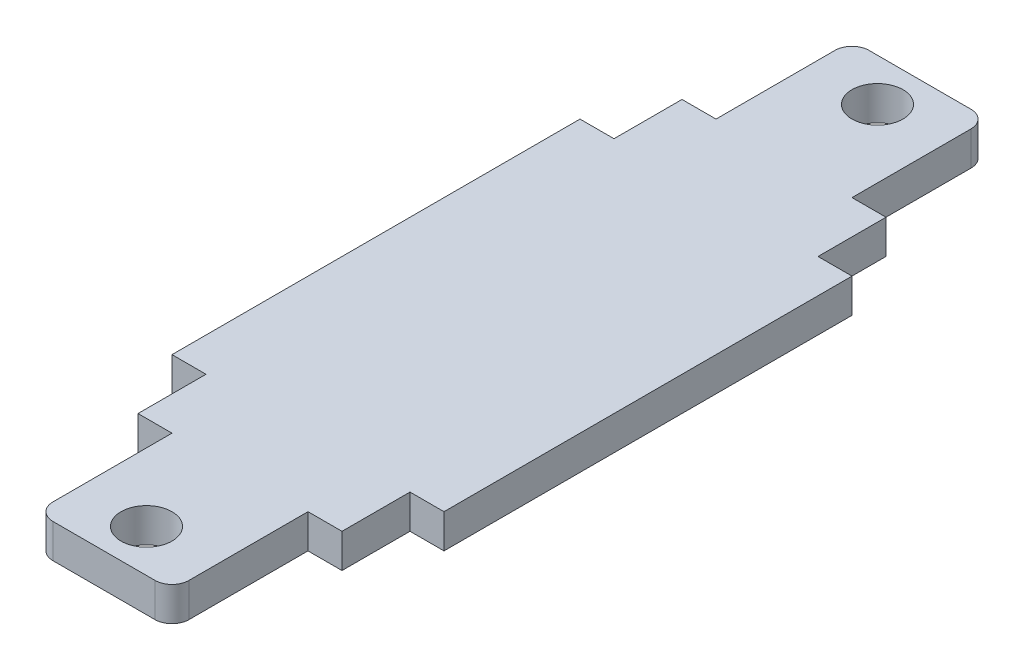
ISO-10303-21;
HEADER;
FILE_DESCRIPTION(('STEP AP214'),'2;1');
FILE_NAME('part.step','',(''),(''),'','','');
FILE_SCHEMA(('AUTOMOTIVE_DESIGN { 1 0 10303 214 1 1 1 1 }'));
ENDSEC;
DATA;
#1=APPLICATION_CONTEXT('core data for automotive mechanical design processes');
#2=APPLICATION_PROTOCOL_DEFINITION('international standard','automotive_design',2000,#1);
#3=PRODUCT_CONTEXT('',#1,'mechanical');
#4=PRODUCT('Part','Part','',(#3));
#5=PRODUCT_RELATED_PRODUCT_CATEGORY('part','',(#4));
#6=PRODUCT_DEFINITION_FORMATION('','',#4);
#7=PRODUCT_DEFINITION_CONTEXT('part definition',#1,'design');
#8=PRODUCT_DEFINITION('design','',#6,#7);
#9=PRODUCT_DEFINITION_SHAPE('','',#8);
#10=(LENGTH_UNIT() NAMED_UNIT(*) SI_UNIT(.MILLI.,.METRE.));
#11=(NAMED_UNIT(*) PLANE_ANGLE_UNIT() SI_UNIT($,.RADIAN.));
#12=(NAMED_UNIT(*) SI_UNIT($,.STERADIAN.) SOLID_ANGLE_UNIT());
#13=UNCERTAINTY_MEASURE_WITH_UNIT(LENGTH_MEASURE(1.E-05),#10,'distance_accuracy_value','');
#14=(GEOMETRIC_REPRESENTATION_CONTEXT(3) GLOBAL_UNCERTAINTY_ASSIGNED_CONTEXT((#13)) GLOBAL_UNIT_ASSIGNED_CONTEXT((#10,
#11,#12)) REPRESENTATION_CONTEXT('',''));
#15=CARTESIAN_POINT('',(0.,0.,0.));
#16=DIRECTION('',(0.,0.,1.));
#17=DIRECTION('',(1.,0.,0.));
#18=AXIS2_PLACEMENT_3D('',#15,#16,#17);
#19=CARTESIAN_POINT('',(191.916318128345,374.20180844309,9.525));
#20=DIRECTION('',(0.,-1.,0.));
#21=DIRECTION('',(0.,0.,-1.));
#22=AXIS2_PLACEMENT_3D('',#19,#20,#21);
#23=PLANE('',#22);
#24=CARTESIAN_POINT('',(179.216318128345,374.20180844309,5.55624999999998));
#25=DIRECTION('',(0.,-1.,0.));
#26=DIRECTION('',(0.,0.,-1.));
#27=AXIS2_PLACEMENT_3D('',#24,#25,#26);
#28=CIRCLE('',#27,2.38125000000001);
#29=CARTESIAN_POINT('',(179.216318128345,374.20180844309,3.17499999999998));
#30=VERTEX_POINT('',#29);
#31=EDGE_CURVE('E302',#30,#30,#28,.T.);
#32=ORIENTED_EDGE('',*,*,#31,.T.);
#33=EDGE_LOOP('',(#32));
#34=FACE_BOUND('',#33,.T.);
#35=CARTESIAN_POINT('',(179.216318128345,374.20180844309,-62.70625));
#36=DIRECTION('',(0.,1.,0.));
#37=DIRECTION('',(0.,0.,1.));
#38=AXIS2_PLACEMENT_3D('',#35,#36,#37);
#39=CIRCLE('',#38,2.38125);
#40=CARTESIAN_POINT('',(179.216318128345,374.20180844309,-60.325));
#41=VERTEX_POINT('',#40);
#42=EDGE_CURVE('E380',#41,#41,#39,.T.);
#43=ORIENTED_EDGE('',*,*,#42,.F.);
#44=EDGE_LOOP('',(#43));
#45=FACE_BOUND('',#44,.T.);
#46=DIRECTION('',(1.,0.,0.));
#47=VECTOR('',#46,1.);
#48=CARTESIAN_POINT('',(0.,374.20180844309,-9.525));
#49=LINE('',#48,#47);
#50=CARTESIAN_POINT('',(166.516318128345,374.20180844309,-9.525));
#51=VERTEX_POINT('',#50);
#52=CARTESIAN_POINT('',(169.691318128345,374.20180844309,-9.525));
#53=VERTEX_POINT('',#52);
#54=EDGE_CURVE('E282',#51,#53,#49,.T.);
#55=ORIENTED_EDGE('',*,*,#54,.T.);
#56=DIRECTION('',(0.,0.,-1.));
#57=VECTOR('',#56,1.);
#58=CARTESIAN_POINT('',(169.691318128345,374.20180844309,0.));
#59=LINE('',#58,#57);
#60=CARTESIAN_POINT('',(169.691318128345,374.20180844309,-3.175));
#61=VERTEX_POINT('',#60);
#62=EDGE_CURVE('E293',#61,#53,#59,.T.);
#63=ORIENTED_EDGE('',*,*,#62,.F.);
#64=DIRECTION('',(1.,0.,0.));
#65=VECTOR('',#64,1.);
#66=CARTESIAN_POINT('',(0.,374.20180844309,-3.17499999999963));
#67=LINE('',#66,#65);
#68=CARTESIAN_POINT('',(172.866318128345,374.20180844309,-3.175));
#69=VERTEX_POINT('',#68);
#70=EDGE_CURVE('E451',#61,#69,#67,.T.);
#71=ORIENTED_EDGE('',*,*,#70,.T.);
#72=DIRECTION('',(0.,0.,-1.));
#73=VECTOR('',#72,1.);
#74=CARTESIAN_POINT('',(172.866318128345,374.20180844309,-4.317664039781E-13));
#75=LINE('',#74,#73);
#76=CARTESIAN_POINT('',(172.866318128345,374.20180844309,7.93749999999999));
#77=VERTEX_POINT('',#76);
#78=EDGE_CURVE('E448',#77,#69,#75,.T.);
#79=ORIENTED_EDGE('',*,*,#78,.F.);
#80=CARTESIAN_POINT('',(174.453818128345,374.20180844309,7.93749999999999));
#81=DIRECTION('',(0.,1.,0.));
#82=DIRECTION('',(0.,0.,1.));
#83=AXIS2_PLACEMENT_3D('',#80,#81,#82);
#84=CIRCLE('',#83,1.58749999999998);
#85=CARTESIAN_POINT('',(174.453818128345,374.20180844309,9.525));
#86=VERTEX_POINT('',#85);
#87=EDGE_CURVE('E445',#86,#77,#84,.F.);
#88=ORIENTED_EDGE('',*,*,#87,.F.);
#89=DIRECTION('',(-1.,0.,0.));
#90=VECTOR('',#89,1.);
#91=CARTESIAN_POINT('',(191.916318128345,374.20180844309,9.525));
#92=LINE('',#91,#90);
#93=CARTESIAN_POINT('',(183.978818128345,374.20180844309,9.525));
#94=VERTEX_POINT('',#93);
#95=EDGE_CURVE('E315',#94,#86,#92,.T.);
#96=ORIENTED_EDGE('',*,*,#95,.F.);
#97=CARTESIAN_POINT('',(183.978818128345,374.20180844309,7.93749999999999));
#98=DIRECTION('',(0.,1.,0.));
#99=DIRECTION('',(0.,0.,1.));
#100=AXIS2_PLACEMENT_3D('',#97,#98,#99);
#101=CIRCLE('',#100,1.58749999999999);
#102=CARTESIAN_POINT('',(185.566318128345,374.20180844309,7.93749999999999));
#103=VERTEX_POINT('',#102);
#104=EDGE_CURVE('E146',#94,#103,#101,.T.);
#105=ORIENTED_EDGE('',*,*,#104,.T.);
#106=DIRECTION('',(0.,0.,-1.));
#107=VECTOR('',#106,1.);
#108=CARTESIAN_POINT('',(185.566318128345,374.20180844309,0.));
#109=LINE('',#108,#107);
#110=CARTESIAN_POINT('',(185.566318128345,374.20180844309,-3.175));
#111=VERTEX_POINT('',#110);
#112=EDGE_CURVE('E441',#103,#111,#109,.T.);
#113=ORIENTED_EDGE('',*,*,#112,.T.);
#114=DIRECTION('',(-1.,0.,0.));
#115=VECTOR('',#114,1.);
#116=CARTESIAN_POINT('',(0.,374.20180844309,-3.175));
#117=LINE('',#116,#115);
#118=CARTESIAN_POINT('',(188.741318128345,374.20180844309,-3.175));
#119=VERTEX_POINT('',#118);
#120=EDGE_CURVE('E438',#119,#111,#117,.T.);
#121=ORIENTED_EDGE('',*,*,#120,.F.);
#122=DIRECTION('',(0.,0.,-1.));
#123=VECTOR('',#122,1.);
#124=CARTESIAN_POINT('',(188.741318128345,374.20180844309,0.));
#125=LINE('',#124,#123);
#126=CARTESIAN_POINT('',(188.741318128345,374.20180844309,-9.525));
#127=VERTEX_POINT('',#126);
#128=EDGE_CURVE('E435',#119,#127,#125,.T.);
#129=ORIENTED_EDGE('',*,*,#128,.T.);
#130=DIRECTION('',(-1.,0.,0.));
#131=VECTOR('',#130,1.);
#132=CARTESIAN_POINT('',(0.,374.20180844309,-9.525));
#133=LINE('',#132,#131);
#134=CARTESIAN_POINT('',(191.916318128345,374.20180844309,-9.525));
#135=VERTEX_POINT('',#134);
#136=EDGE_CURVE('E407',#135,#127,#133,.T.);
#137=ORIENTED_EDGE('',*,*,#136,.F.);
#138=DIRECTION('',(0.,0.,-1.));
#139=VECTOR('',#138,1.);
#140=CARTESIAN_POINT('',(191.916318128345,374.20180844309,9.525));
#141=LINE('',#140,#139);
#142=CARTESIAN_POINT('',(191.916318128345,374.20180844309,-47.625));
#143=VERTEX_POINT('',#142);
#144=EDGE_CURVE('E12',#135,#143,#141,.T.);
#145=ORIENTED_EDGE('',*,*,#144,.T.);
#146=DIRECTION('',(-1.,0.,0.));
#147=VECTOR('',#146,1.);
#148=CARTESIAN_POINT('',(0.,374.20180844309,-47.625));
#149=LINE('',#148,#147);
#150=CARTESIAN_POINT('',(188.741318128345,374.20180844309,-47.625));
#151=VERTEX_POINT('',#150);
#152=EDGE_CURVE('E362',#143,#151,#149,.T.);
#153=ORIENTED_EDGE('',*,*,#152,.T.);
#154=DIRECTION('',(0.,0.,1.));
#155=VECTOR('',#154,1.);
#156=CARTESIAN_POINT('',(188.741318128345,374.20180844309,0.));
#157=LINE('',#156,#155);
#158=CARTESIAN_POINT('',(188.741318128345,374.20180844309,-53.975));
#159=VERTEX_POINT('',#158);
#160=EDGE_CURVE('E365',#159,#151,#157,.T.);
#161=ORIENTED_EDGE('',*,*,#160,.F.);
#162=DIRECTION('',(-1.,0.,0.));
#163=VECTOR('',#162,1.);
#164=CARTESIAN_POINT('',(0.,374.20180844309,-53.975));
#165=LINE('',#164,#163);
#166=CARTESIAN_POINT('',(185.566318128345,374.20180844309,-53.975));
#167=VERTEX_POINT('',#166);
#168=EDGE_CURVE('E368',#159,#167,#165,.T.);
#169=ORIENTED_EDGE('',*,*,#168,.T.);
#170=DIRECTION('',(0.,0.,1.));
#171=VECTOR('',#170,1.);
#172=CARTESIAN_POINT('',(185.566318128345,374.20180844309,0.));
#173=LINE('',#172,#171);
#174=CARTESIAN_POINT('',(185.566318128345,374.20180844309,-65.0875));
#175=VERTEX_POINT('',#174);
#176=EDGE_CURVE('E371',#175,#167,#173,.T.);
#177=ORIENTED_EDGE('',*,*,#176,.F.);
#178=CARTESIAN_POINT('',(183.978818128345,374.20180844309,-65.0875));
#179=DIRECTION('',(0.,1.,0.));
#180=DIRECTION('',(0.,0.,1.));
#181=AXIS2_PLACEMENT_3D('',#178,#179,#180);
#182=CIRCLE('',#181,1.58749999999999);
#183=CARTESIAN_POINT('',(183.978818128345,374.20180844309,-66.675));
#184=VERTEX_POINT('',#183);
#185=EDGE_CURVE('E374',#184,#175,#182,.F.);
#186=ORIENTED_EDGE('',*,*,#185,.F.);
#187=DIRECTION('',(-1.,0.,0.));
#188=VECTOR('',#187,1.);
#189=CARTESIAN_POINT('',(191.916318128345,374.20180844309,-66.675));
#190=LINE('',#189,#188);
#191=CARTESIAN_POINT('',(174.453818128345,374.20180844309,-66.675));
#192=VERTEX_POINT('',#191);
#193=EDGE_CURVE('E321',#184,#192,#190,.T.);
#194=ORIENTED_EDGE('',*,*,#193,.T.);
#195=CARTESIAN_POINT('',(174.453818128345,374.20180844309,-65.0875));
#196=DIRECTION('',(0.,1.,0.));
#197=DIRECTION('',(0.,0.,1.));
#198=AXIS2_PLACEMENT_3D('',#195,#196,#197);
#199=CIRCLE('',#198,1.58749999999998);
#200=CARTESIAN_POINT('',(172.866318128345,374.20180844309,-65.0875));
#201=VERTEX_POINT('',#200);
#202=EDGE_CURVE('E377',#192,#201,#199,.T.);
#203=ORIENTED_EDGE('',*,*,#202,.T.);
#204=DIRECTION('',(0.,0.,1.));
#205=VECTOR('',#204,1.);
#206=CARTESIAN_POINT('',(172.866318128344,374.20180844309,4.31766403978099E-13));
#207=LINE('',#206,#205);
#208=CARTESIAN_POINT('',(172.866318128345,374.20180844309,-53.975));
#209=VERTEX_POINT('',#208);
#210=EDGE_CURVE('E352',#201,#209,#207,.T.);
#211=ORIENTED_EDGE('',*,*,#210,.T.);
#212=DIRECTION('',(1.,0.,0.));
#213=VECTOR('',#212,1.);
#214=CARTESIAN_POINT('',(1.17961196366424E-13,374.20180844309,-53.9750000000004));
#215=LINE('',#214,#213);
#216=CARTESIAN_POINT('',(169.691318128345,374.20180844309,-53.975));
#217=VERTEX_POINT('',#216);
#218=EDGE_CURVE('E356',#217,#209,#215,.T.);
#219=ORIENTED_EDGE('',*,*,#218,.F.);
#220=DIRECTION('',(0.,0.,1.));
#221=VECTOR('',#220,1.);
#222=CARTESIAN_POINT('',(169.691318128345,374.20180844309,0.));
#223=LINE('',#222,#221);
#224=CARTESIAN_POINT('',(169.691318128345,374.20180844309,-47.625));
#225=VERTEX_POINT('',#224);
#226=EDGE_CURVE('E359',#217,#225,#223,.T.);
#227=ORIENTED_EDGE('',*,*,#226,.T.);
#228=DIRECTION('',(1.,0.,0.));
#229=VECTOR('',#228,1.);
#230=CARTESIAN_POINT('',(0.,374.20180844309,-47.625));
#231=LINE('',#230,#229);
#232=CARTESIAN_POINT('',(166.516318128345,374.20180844309,-47.625));
#233=VERTEX_POINT('',#232);
#234=EDGE_CURVE('E307',#233,#225,#231,.T.);
#235=ORIENTED_EDGE('',*,*,#234,.F.);
#236=DIRECTION('',(0.,0.,-1.));
#237=VECTOR('',#236,1.);
#238=CARTESIAN_POINT('',(166.516318128345,374.20180844309,9.525));
#239=LINE('',#238,#237);
#240=EDGE_CURVE('E131',#51,#233,#239,.T.);
#241=ORIENTED_EDGE('',*,*,#240,.F.);
#242=EDGE_LOOP('',(#55,#63,#71,#79,#88,#96,#105,#113,#121,#129,#137,#145,#153,#161,#169,#177,
#186,#194,#203,#211,#219,#227,#235,#241));
#243=FACE_BOUND('',#242,.T.);
#244=ADVANCED_FACE('F123',(#34,#45,#243),#23,.F.);
#245=CARTESIAN_POINT('',(191.916318128345,371.02680844309,9.525));
#246=DIRECTION('',(0.,-1.,0.));
#247=DIRECTION('',(0.,0.,-1.));
#248=AXIS2_PLACEMENT_3D('',#245,#246,#247);
#249=PLANE('',#248);
#250=CARTESIAN_POINT('',(179.216318128345,371.02680844309,5.55624999999998));
#251=DIRECTION('',(0.,-1.,0.));
#252=DIRECTION('',(0.,0.,-1.));
#253=AXIS2_PLACEMENT_3D('',#250,#251,#252);
#254=CIRCLE('',#253,2.38125000000001);
#255=CARTESIAN_POINT('',(179.216318128345,371.02680844309,3.17499999999998));
#256=VERTEX_POINT('',#255);
#257=EDGE_CURVE('E475',#256,#256,#254,.T.);
#258=ORIENTED_EDGE('',*,*,#257,.F.);
#259=EDGE_LOOP('',(#258));
#260=FACE_BOUND('',#259,.T.);
#261=CARTESIAN_POINT('',(179.216318128345,371.02680844309,-62.70625));
#262=DIRECTION('',(0.,1.,0.));
#263=DIRECTION('',(0.,0.,1.));
#264=AXIS2_PLACEMENT_3D('',#261,#262,#263);
#265=CIRCLE('',#264,2.38125);
#266=CARTESIAN_POINT('',(179.216318128345,371.02680844309,-60.325));
#267=VERTEX_POINT('',#266);
#268=EDGE_CURVE('E404',#267,#267,#265,.T.);
#269=ORIENTED_EDGE('',*,*,#268,.T.);
#270=EDGE_LOOP('',(#269));
#271=FACE_BOUND('',#270,.T.);
#272=DIRECTION('',(0.,0.,-1.));
#273=VECTOR('',#272,1.);
#274=CARTESIAN_POINT('',(169.691318128345,371.02680844309,0.));
#275=LINE('',#274,#273);
#276=CARTESIAN_POINT('',(169.691318128345,371.02680844309,-3.175));
#277=VERTEX_POINT('',#276);
#278=CARTESIAN_POINT('',(169.691318128345,371.02680844309,-9.525));
#279=VERTEX_POINT('',#278);
#280=EDGE_CURVE('E427',#277,#279,#275,.T.);
#281=ORIENTED_EDGE('',*,*,#280,.T.);
#282=DIRECTION('',(1.,0.,0.));
#283=VECTOR('',#282,1.);
#284=CARTESIAN_POINT('',(0.,371.02680844309,-9.525));
#285=LINE('',#284,#283);
#286=CARTESIAN_POINT('',(166.516318128345,371.02680844309,-9.525));
#287=VERTEX_POINT('',#286);
#288=EDGE_CURVE('E430',#287,#279,#285,.T.);
#289=ORIENTED_EDGE('',*,*,#288,.F.);
#290=DIRECTION('',(0.,0.,-1.));
#291=VECTOR('',#290,1.);
#292=CARTESIAN_POINT('',(166.516318128345,371.02680844309,9.525));
#293=LINE('',#292,#291);
#294=CARTESIAN_POINT('',(166.516318128345,371.02680844309,-47.625));
#295=VERTEX_POINT('',#294);
#296=EDGE_CURVE('E301',#287,#295,#293,.T.);
#297=ORIENTED_EDGE('',*,*,#296,.T.);
#298=DIRECTION('',(1.,0.,0.));
#299=VECTOR('',#298,1.);
#300=CARTESIAN_POINT('',(0.,371.02680844309,-47.625));
#301=LINE('',#300,#299);
#302=CARTESIAN_POINT('',(169.691318128345,371.02680844309,-47.625));
#303=VERTEX_POINT('',#302);
#304=EDGE_CURVE('E387',#295,#303,#301,.T.);
#305=ORIENTED_EDGE('',*,*,#304,.T.);
#306=DIRECTION('',(0.,0.,1.));
#307=VECTOR('',#306,1.);
#308=CARTESIAN_POINT('',(169.691318128345,371.02680844309,0.));
#309=LINE('',#308,#307);
#310=CARTESIAN_POINT('',(169.691318128345,371.02680844309,-53.975));
#311=VERTEX_POINT('',#310);
#312=EDGE_CURVE('E385',#311,#303,#309,.T.);
#313=ORIENTED_EDGE('',*,*,#312,.F.);
#314=DIRECTION('',(1.,0.,0.));
#315=VECTOR('',#314,1.);
#316=CARTESIAN_POINT('',(1.17961196366424E-13,371.02680844309,-53.9750000000004));
#317=LINE('',#316,#315);
#318=CARTESIAN_POINT('',(172.866318128345,371.02680844309,-53.975));
#319=VERTEX_POINT('',#318);
#320=EDGE_CURVE('E382',#311,#319,#317,.T.);
#321=ORIENTED_EDGE('',*,*,#320,.T.);
#322=DIRECTION('',(0.,0.,1.));
#323=VECTOR('',#322,1.);
#324=CARTESIAN_POINT('',(172.866318128344,371.02680844309,4.31766403978099E-13));
#325=LINE('',#324,#323);
#326=CARTESIAN_POINT('',(172.866318128345,371.02680844309,-65.0875));
#327=VERTEX_POINT('',#326);
#328=EDGE_CURVE('E329',#327,#319,#325,.T.);
#329=ORIENTED_EDGE('',*,*,#328,.F.);
#330=CARTESIAN_POINT('',(174.453818128345,371.02680844309,-65.0875));
#331=DIRECTION('',(0.,1.,0.));
#332=DIRECTION('',(0.,0.,1.));
#333=AXIS2_PLACEMENT_3D('',#330,#331,#332);
#334=CIRCLE('',#333,1.58749999999998);
#335=CARTESIAN_POINT('',(174.453818128345,371.02680844309,-66.675));
#336=VERTEX_POINT('',#335);
#337=EDGE_CURVE('E355',#336,#327,#334,.T.);
#338=ORIENTED_EDGE('',*,*,#337,.F.);
#339=DIRECTION('',(-1.,0.,0.));
#340=VECTOR('',#339,1.);
#341=CARTESIAN_POINT('',(191.916318128345,371.02680844309,-66.675));
#342=LINE('',#341,#340);
#343=CARTESIAN_POINT('',(183.978818128345,371.02680844309,-66.675));
#344=VERTEX_POINT('',#343);
#345=EDGE_CURVE('E318',#344,#336,#342,.T.);
#346=ORIENTED_EDGE('',*,*,#345,.F.);
#347=CARTESIAN_POINT('',(183.978818128345,371.02680844309,-65.0875));
#348=DIRECTION('',(0.,1.,0.));
#349=DIRECTION('',(0.,0.,1.));
#350=AXIS2_PLACEMENT_3D('',#347,#348,#349);
#351=CIRCLE('',#350,1.58749999999999);
#352=CARTESIAN_POINT('',(185.566318128345,371.02680844309,-65.0875));
#353=VERTEX_POINT('',#352);
#354=EDGE_CURVE('E400',#344,#353,#351,.F.);
#355=ORIENTED_EDGE('',*,*,#354,.T.);
#356=DIRECTION('',(0.,0.,1.));
#357=VECTOR('',#356,1.);
#358=CARTESIAN_POINT('',(185.566318128345,371.02680844309,0.));
#359=LINE('',#358,#357);
#360=CARTESIAN_POINT('',(185.566318128345,371.02680844309,-53.975));
#361=VERTEX_POINT('',#360);
#362=EDGE_CURVE('E397',#353,#361,#359,.T.);
#363=ORIENTED_EDGE('',*,*,#362,.T.);
#364=DIRECTION('',(-1.,0.,0.));
#365=VECTOR('',#364,1.);
#366=CARTESIAN_POINT('',(0.,371.02680844309,-53.975));
#367=LINE('',#366,#365);
#368=CARTESIAN_POINT('',(188.741318128345,371.02680844309,-53.975));
#369=VERTEX_POINT('',#368);
#370=EDGE_CURVE('E395',#369,#361,#367,.T.);
#371=ORIENTED_EDGE('',*,*,#370,.F.);
#372=DIRECTION('',(0.,0.,1.));
#373=VECTOR('',#372,1.);
#374=CARTESIAN_POINT('',(188.741318128345,371.02680844309,0.));
#375=LINE('',#374,#373);
#376=CARTESIAN_POINT('',(188.741318128345,371.02680844309,-47.625));
#377=VERTEX_POINT('',#376);
#378=EDGE_CURVE('E392',#369,#377,#375,.T.);
#379=ORIENTED_EDGE('',*,*,#378,.T.);
#380=DIRECTION('',(-1.,0.,0.));
#381=VECTOR('',#380,1.);
#382=CARTESIAN_POINT('',(0.,371.02680844309,-47.625));
#383=LINE('',#382,#381);
#384=CARTESIAN_POINT('',(191.916318128345,371.02680844309,-47.625));
#385=VERTEX_POINT('',#384);
#386=EDGE_CURVE('E390',#385,#377,#383,.T.);
#387=ORIENTED_EDGE('',*,*,#386,.F.);
#388=DIRECTION('',(0.,0.,-1.));
#389=VECTOR('',#388,1.);
#390=CARTESIAN_POINT('',(191.916318128345,371.02680844309,9.525));
#391=LINE('',#390,#389);
#392=CARTESIAN_POINT('',(191.916318128345,371.02680844309,-9.525));
#393=VERTEX_POINT('',#392);
#394=EDGE_CURVE('E308',#393,#385,#391,.T.);
#395=ORIENTED_EDGE('',*,*,#394,.F.);
#396=DIRECTION('',(-1.,0.,0.));
#397=VECTOR('',#396,1.);
#398=CARTESIAN_POINT('',(0.,371.02680844309,-9.525));
#399=LINE('',#398,#397);
#400=CARTESIAN_POINT('',(188.741318128345,371.02680844309,-9.525));
#401=VERTEX_POINT('',#400);
#402=EDGE_CURVE('E294',#393,#401,#399,.T.);
#403=ORIENTED_EDGE('',*,*,#402,.T.);
#404=DIRECTION('',(0.,0.,-1.));
#405=VECTOR('',#404,1.);
#406=CARTESIAN_POINT('',(188.741318128345,371.02680844309,0.));
#407=LINE('',#406,#405);
#408=CARTESIAN_POINT('',(188.741318128345,371.02680844309,-3.175));
#409=VERTEX_POINT('',#408);
#410=EDGE_CURVE('E412',#409,#401,#407,.T.);
#411=ORIENTED_EDGE('',*,*,#410,.F.);
#412=DIRECTION('',(-1.,0.,0.));
#413=VECTOR('',#412,1.);
#414=CARTESIAN_POINT('',(0.,371.02680844309,-3.175));
#415=LINE('',#414,#413);
#416=CARTESIAN_POINT('',(185.566318128345,371.02680844309,-3.175));
#417=VERTEX_POINT('',#416);
#418=EDGE_CURVE('E414',#409,#417,#415,.T.);
#419=ORIENTED_EDGE('',*,*,#418,.T.);
#420=DIRECTION('',(0.,0.,-1.));
#421=VECTOR('',#420,1.);
#422=CARTESIAN_POINT('',(185.566318128345,371.02680844309,0.));
#423=LINE('',#422,#421);
#424=CARTESIAN_POINT('',(185.566318128345,371.02680844309,7.93749999999999));
#425=VERTEX_POINT('',#424);
#426=EDGE_CURVE('E417',#425,#417,#423,.T.);
#427=ORIENTED_EDGE('',*,*,#426,.F.);
#428=CARTESIAN_POINT('',(183.978818128345,371.02680844309,7.93749999999999));
#429=DIRECTION('',(0.,1.,0.));
#430=DIRECTION('',(0.,0.,1.));
#431=AXIS2_PLACEMENT_3D('',#428,#429,#430);
#432=CIRCLE('',#431,1.58749999999999);
#433=CARTESIAN_POINT('',(183.978818128345,371.02680844309,9.525));
#434=VERTEX_POINT('',#433);
#435=EDGE_CURVE('E419',#434,#425,#432,.T.);
#436=ORIENTED_EDGE('',*,*,#435,.F.);
#437=DIRECTION('',(-1.,0.,0.));
#438=VECTOR('',#437,1.);
#439=CARTESIAN_POINT('',(191.916318128345,371.02680844309,9.525));
#440=LINE('',#439,#438);
#441=CARTESIAN_POINT('',(174.453818128345,371.02680844309,9.525));
#442=VERTEX_POINT('',#441);
#443=EDGE_CURVE('E312',#434,#442,#440,.T.);
#444=ORIENTED_EDGE('',*,*,#443,.T.);
#445=CARTESIAN_POINT('',(174.453818128345,371.02680844309,7.93749999999999));
#446=DIRECTION('',(0.,1.,0.));
#447=DIRECTION('',(0.,0.,1.));
#448=AXIS2_PLACEMENT_3D('',#445,#446,#447);
#449=CIRCLE('',#448,1.58749999999998);
#450=CARTESIAN_POINT('',(172.866318128345,371.02680844309,7.93749999999999));
#451=VERTEX_POINT('',#450);
#452=EDGE_CURVE('E138',#442,#451,#449,.F.);
#453=ORIENTED_EDGE('',*,*,#452,.T.);
#454=DIRECTION('',(0.,0.,-1.));
#455=VECTOR('',#454,1.);
#456=CARTESIAN_POINT('',(172.866318128345,371.02680844309,-4.317664039781E-13));
#457=LINE('',#456,#455);
#458=CARTESIAN_POINT('',(172.866318128345,371.02680844309,-3.175));
#459=VERTEX_POINT('',#458);
#460=EDGE_CURVE('E422',#451,#459,#457,.T.);
#461=ORIENTED_EDGE('',*,*,#460,.T.);
#462=DIRECTION('',(1.,0.,0.));
#463=VECTOR('',#462,1.);
#464=CARTESIAN_POINT('',(0.,371.02680844309,-3.17499999999963));
#465=LINE('',#464,#463);
#466=EDGE_CURVE('E425',#277,#459,#465,.T.);
#467=ORIENTED_EDGE('',*,*,#466,.F.);
#468=EDGE_LOOP('',(#281,#289,#297,#305,#313,#321,#329,#338,#346,#355,#363,#371,#379,#387,#395,
#403,#411,#419,#427,#436,#444,#453,#461,#467));
#469=FACE_BOUND('',#468,.T.);
#470=ADVANCED_FACE('F495',(#260,#271,#469),#249,.T.);
#471=CARTESIAN_POINT('',(166.516318128345,371.02680844309,9.525));
#472=DIRECTION('',(-1.,0.,0.));
#473=DIRECTION('',(0.,0.,1.));
#474=AXIS2_PLACEMENT_3D('',#471,#472,#473);
#475=PLANE('',#474);
#476=ORIENTED_EDGE('',*,*,#296,.F.);
#477=DIRECTION('',(0.,1.,0.));
#478=VECTOR('',#477,1.);
#479=CARTESIAN_POINT('',(166.516318128345,371.02680844309,-9.525));
#480=LINE('',#479,#478);
#481=EDGE_CURVE('E285',#287,#51,#480,.T.);
#482=ORIENTED_EDGE('',*,*,#481,.T.);
#483=ORIENTED_EDGE('',*,*,#240,.T.);
#484=DIRECTION('',(0.,1.,0.));
#485=VECTOR('',#484,1.);
#486=CARTESIAN_POINT('',(166.516318128345,371.02680844309,-47.625));
#487=LINE('',#486,#485);
#488=EDGE_CURVE('E342',#295,#233,#487,.T.);
#489=ORIENTED_EDGE('',*,*,#488,.F.);
#490=EDGE_LOOP('',(#476,#482,#483,#489));
#491=FACE_BOUND('',#490,.T.);
#492=ADVANCED_FACE('F298',(#491),#475,.T.);
#493=CARTESIAN_POINT('',(0.,0.,9.525));
#494=DIRECTION('',(0.,0.,1.));
#495=DIRECTION('',(1.,0.,0.));
#496=AXIS2_PLACEMENT_3D('',#493,#494,#495);
#497=PLANE('',#496);
#498=ORIENTED_EDGE('',*,*,#95,.T.);
#499=DIRECTION('',(0.,1.,0.));
#500=VECTOR('',#499,1.);
#501=CARTESIAN_POINT('',(174.453818128345,371.02680844309,9.525));
#502=LINE('',#501,#500);
#503=EDGE_CURVE('E462',#442,#86,#502,.T.);
#504=ORIENTED_EDGE('',*,*,#503,.F.);
#505=ORIENTED_EDGE('',*,*,#443,.F.);
#506=DIRECTION('',(0.,1.,0.));
#507=VECTOR('',#506,1.);
#508=CARTESIAN_POINT('',(183.978818128345,371.02680844309,9.525));
#509=LINE('',#508,#507);
#510=EDGE_CURVE('E464',#434,#94,#509,.T.);
#511=ORIENTED_EDGE('',*,*,#510,.T.);
#512=EDGE_LOOP('',(#498,#504,#505,#511));
#513=FACE_BOUND('',#512,.T.);
#514=ADVANCED_FACE('F503',(#513),#497,.T.);
#515=CARTESIAN_POINT('',(191.916318128345,371.02680844309,9.525));
#516=DIRECTION('',(-1.,0.,0.));
#517=DIRECTION('',(0.,0.,1.));
#518=AXIS2_PLACEMENT_3D('',#515,#516,#517);
#519=PLANE('',#518);
#520=ORIENTED_EDGE('',*,*,#144,.F.);
#521=DIRECTION('',(0.,1.,0.));
#522=VECTOR('',#521,1.);
#523=CARTESIAN_POINT('',(191.916318128345,371.02680844309,-9.525));
#524=LINE('',#523,#522);
#525=EDGE_CURVE('E432',#393,#135,#524,.T.);
#526=ORIENTED_EDGE('',*,*,#525,.F.);
#527=ORIENTED_EDGE('',*,*,#394,.T.);
#528=DIRECTION('',(0.,1.,0.));
#529=VECTOR('',#528,1.);
#530=CARTESIAN_POINT('',(191.916318128345,371.02680844309,-47.625));
#531=LINE('',#530,#529);
#532=EDGE_CURVE('E339',#385,#143,#531,.T.);
#533=ORIENTED_EDGE('',*,*,#532,.T.);
#534=EDGE_LOOP('',(#520,#526,#527,#533));
#535=FACE_BOUND('',#534,.T.);
#536=ADVANCED_FACE('F125',(#535),#519,.F.);
#537=CARTESIAN_POINT('',(0.,0.,-66.675));
#538=DIRECTION('',(0.,0.,1.));
#539=DIRECTION('',(1.,0.,0.));
#540=AXIS2_PLACEMENT_3D('',#537,#538,#539);
#541=PLANE('',#540);
#542=ORIENTED_EDGE('',*,*,#345,.T.);
#543=DIRECTION('',(0.,1.,0.));
#544=VECTOR('',#543,1.);
#545=CARTESIAN_POINT('',(174.453818128345,371.02680844309,-66.675));
#546=LINE('',#545,#544);
#547=EDGE_CURVE('E325',#336,#192,#546,.T.);
#548=ORIENTED_EDGE('',*,*,#547,.T.);
#549=ORIENTED_EDGE('',*,*,#193,.F.);
#550=DIRECTION('',(0.,1.,0.));
#551=VECTOR('',#550,1.);
#552=CARTESIAN_POINT('',(183.978818128345,371.02680844309,-66.675));
#553=LINE('',#552,#551);
#554=EDGE_CURVE('E328',#344,#184,#553,.T.);
#555=ORIENTED_EDGE('',*,*,#554,.F.);
#556=EDGE_LOOP('',(#542,#548,#549,#555));
#557=FACE_BOUND('',#556,.T.);
#558=ADVANCED_FACE('F508',(#557),#541,.F.);
#559=CARTESIAN_POINT('',(183.978818128345,371.02680844309,-65.0875));
#560=DIRECTION('',(0.,1.,0.));
#561=DIRECTION('',(0.,0.,1.));
#562=AXIS2_PLACEMENT_3D('',#559,#560,#561);
#563=CYLINDRICAL_SURFACE('',#562,1.58749999999999);
#564=ORIENTED_EDGE('',*,*,#185,.T.);
#565=DIRECTION('',(0.,1.,0.));
#566=VECTOR('',#565,1.);
#567=CARTESIAN_POINT('',(185.566318128345,371.02680844309,-65.0875));
#568=LINE('',#567,#566);
#569=EDGE_CURVE('E331',#353,#175,#568,.T.);
#570=ORIENTED_EDGE('',*,*,#569,.F.);
#571=ORIENTED_EDGE('',*,*,#354,.F.);
#572=ORIENTED_EDGE('',*,*,#554,.T.);
#573=EDGE_LOOP('',(#564,#570,#571,#572));
#574=FACE_BOUND('',#573,.T.);
#575=ADVANCED_FACE('F511',(#574),#563,.T.);
#576=CARTESIAN_POINT('',(185.566318128345,371.02680844309,0.));
#577=DIRECTION('',(-1.,0.,0.));
#578=DIRECTION('',(0.,0.,1.));
#579=AXIS2_PLACEMENT_3D('',#576,#577,#578);
#580=PLANE('',#579);
#581=ORIENTED_EDGE('',*,*,#176,.T.);
#582=DIRECTION('',(0.,1.,0.));
#583=VECTOR('',#582,1.);
#584=CARTESIAN_POINT('',(185.566318128345,371.02680844309,-53.975));
#585=LINE('',#584,#583);
#586=EDGE_CURVE('E333',#361,#167,#585,.T.);
#587=ORIENTED_EDGE('',*,*,#586,.F.);
#588=ORIENTED_EDGE('',*,*,#362,.F.);
#589=ORIENTED_EDGE('',*,*,#569,.T.);
#590=EDGE_LOOP('',(#581,#587,#588,#589));
#591=FACE_BOUND('',#590,.T.);
#592=ADVANCED_FACE('F521',(#591),#580,.F.);
#593=CARTESIAN_POINT('',(0.,371.02680844309,-53.975));
#594=DIRECTION('',(0.,0.,-1.));
#595=DIRECTION('',(-1.,0.,0.));
#596=AXIS2_PLACEMENT_3D('',#593,#594,#595);
#597=PLANE('',#596);
#598=ORIENTED_EDGE('',*,*,#168,.F.);
#599=DIRECTION('',(0.,1.,0.));
#600=VECTOR('',#599,1.);
#601=CARTESIAN_POINT('',(188.741318128345,371.02680844309,-53.975));
#602=LINE('',#601,#600);
#603=EDGE_CURVE('E335',#369,#159,#602,.T.);
#604=ORIENTED_EDGE('',*,*,#603,.F.);
#605=ORIENTED_EDGE('',*,*,#370,.T.);
#606=ORIENTED_EDGE('',*,*,#586,.T.);
#607=EDGE_LOOP('',(#598,#604,#605,#606));
#608=FACE_BOUND('',#607,.T.);
#609=ADVANCED_FACE('F525',(#608),#597,.T.);
#610=CARTESIAN_POINT('',(188.741318128345,371.02680844309,0.));
#611=DIRECTION('',(-1.,0.,0.));
#612=DIRECTION('',(0.,0.,1.));
#613=AXIS2_PLACEMENT_3D('',#610,#611,#612);
#614=PLANE('',#613);
#615=ORIENTED_EDGE('',*,*,#160,.T.);
#616=DIRECTION('',(0.,1.,0.));
#617=VECTOR('',#616,1.);
#618=CARTESIAN_POINT('',(188.741318128345,371.02680844309,-47.625));
#619=LINE('',#618,#617);
#620=EDGE_CURVE('E337',#377,#151,#619,.T.);
#621=ORIENTED_EDGE('',*,*,#620,.F.);
#622=ORIENTED_EDGE('',*,*,#378,.F.);
#623=ORIENTED_EDGE('',*,*,#603,.T.);
#624=EDGE_LOOP('',(#615,#621,#622,#623));
#625=FACE_BOUND('',#624,.T.);
#626=ADVANCED_FACE('F529',(#625),#614,.F.);
#627=CARTESIAN_POINT('',(0.,371.02680844309,-47.625));
#628=DIRECTION('',(0.,0.,-1.));
#629=DIRECTION('',(-1.,0.,0.));
#630=AXIS2_PLACEMENT_3D('',#627,#628,#629);
#631=PLANE('',#630);
#632=ORIENTED_EDGE('',*,*,#152,.F.);
#633=ORIENTED_EDGE('',*,*,#532,.F.);
#634=ORIENTED_EDGE('',*,*,#386,.T.);
#635=ORIENTED_EDGE('',*,*,#620,.T.);
#636=EDGE_LOOP('',(#632,#633,#634,#635));
#637=FACE_BOUND('',#636,.T.);
#638=ADVANCED_FACE('F517',(#637),#631,.T.);
#639=CARTESIAN_POINT('',(174.453818128345,371.02680844309,-65.0875));
#640=DIRECTION('',(0.,1.,0.));
#641=DIRECTION('',(0.,0.,1.));
#642=AXIS2_PLACEMENT_3D('',#639,#640,#641);
#643=CYLINDRICAL_SURFACE('',#642,1.58749999999998);
#644=ORIENTED_EDGE('',*,*,#202,.F.);
#645=ORIENTED_EDGE('',*,*,#547,.F.);
#646=ORIENTED_EDGE('',*,*,#337,.T.);
#647=DIRECTION('',(0.,1.,0.));
#648=VECTOR('',#647,1.);
#649=CARTESIAN_POINT('',(172.866318128345,371.02680844309,-65.0875));
#650=LINE('',#649,#648);
#651=EDGE_CURVE('E324',#327,#201,#650,.T.);
#652=ORIENTED_EDGE('',*,*,#651,.T.);
#653=EDGE_LOOP('',(#644,#645,#646,#652));
#654=FACE_BOUND('',#653,.T.);
#655=ADVANCED_FACE('F513',(#654),#643,.T.);
#656=CARTESIAN_POINT('',(172.866318128344,371.02680844309,4.31766403978099E-13));
#657=DIRECTION('',(-1.,0.,0.));
#658=DIRECTION('',(0.,0.,1.));
#659=AXIS2_PLACEMENT_3D('',#656,#657,#658);
#660=PLANE('',#659);
#661=ORIENTED_EDGE('',*,*,#210,.F.);
#662=ORIENTED_EDGE('',*,*,#651,.F.);
#663=ORIENTED_EDGE('',*,*,#328,.T.);
#664=DIRECTION('',(0.,1.,0.));
#665=VECTOR('',#664,1.);
#666=CARTESIAN_POINT('',(172.866318128345,371.02680844309,-53.975));
#667=LINE('',#666,#665);
#668=EDGE_CURVE('E348',#319,#209,#667,.T.);
#669=ORIENTED_EDGE('',*,*,#668,.T.);
#670=EDGE_LOOP('',(#661,#662,#663,#669));
#671=FACE_BOUND('',#670,.T.);
#672=ADVANCED_FACE('F516',(#671),#660,.T.);
#673=CARTESIAN_POINT('',(1.17961196366424E-13,371.02680844309,-53.9750000000004));
#674=DIRECTION('',(0.,0.,1.));
#675=DIRECTION('',(1.,0.,0.));
#676=AXIS2_PLACEMENT_3D('',#673,#674,#675);
#677=PLANE('',#676);
#678=ORIENTED_EDGE('',*,*,#218,.T.);
#679=ORIENTED_EDGE('',*,*,#668,.F.);
#680=ORIENTED_EDGE('',*,*,#320,.F.);
#681=DIRECTION('',(0.,1.,0.));
#682=VECTOR('',#681,1.);
#683=CARTESIAN_POINT('',(169.691318128345,371.02680844309,-53.975));
#684=LINE('',#683,#682);
#685=EDGE_CURVE('E346',#311,#217,#684,.T.);
#686=ORIENTED_EDGE('',*,*,#685,.T.);
#687=EDGE_LOOP('',(#678,#679,#680,#686));
#688=FACE_BOUND('',#687,.T.);
#689=ADVANCED_FACE('F545',(#688),#677,.F.);
#690=CARTESIAN_POINT('',(169.691318128345,371.02680844309,0.));
#691=DIRECTION('',(-1.,0.,0.));
#692=DIRECTION('',(0.,0.,1.));
#693=AXIS2_PLACEMENT_3D('',#690,#691,#692);
#694=PLANE('',#693);
#695=ORIENTED_EDGE('',*,*,#226,.F.);
#696=ORIENTED_EDGE('',*,*,#685,.F.);
#697=ORIENTED_EDGE('',*,*,#312,.T.);
#698=DIRECTION('',(0.,1.,0.));
#699=VECTOR('',#698,1.);
#700=CARTESIAN_POINT('',(169.691318128345,371.02680844309,-47.625));
#701=LINE('',#700,#699);
#702=EDGE_CURVE('E344',#303,#225,#701,.T.);
#703=ORIENTED_EDGE('',*,*,#702,.T.);
#704=EDGE_LOOP('',(#695,#696,#697,#703));
#705=FACE_BOUND('',#704,.T.);
#706=ADVANCED_FACE('F541',(#705),#694,.T.);
#707=CARTESIAN_POINT('',(0.,371.02680844309,-47.625));
#708=DIRECTION('',(0.,0.,1.));
#709=DIRECTION('',(1.,0.,0.));
#710=AXIS2_PLACEMENT_3D('',#707,#708,#709);
#711=PLANE('',#710);
#712=ORIENTED_EDGE('',*,*,#234,.T.);
#713=ORIENTED_EDGE('',*,*,#702,.F.);
#714=ORIENTED_EDGE('',*,*,#304,.F.);
#715=ORIENTED_EDGE('',*,*,#488,.T.);
#716=EDGE_LOOP('',(#712,#713,#714,#715));
#717=FACE_BOUND('',#716,.T.);
#718=ADVANCED_FACE('F537',(#717),#711,.F.);
#719=CARTESIAN_POINT('',(179.216318128345,371.02680844309,-62.70625));
#720=DIRECTION('',(0.,1.,0.));
#721=DIRECTION('',(0.,0.,1.));
#722=AXIS2_PLACEMENT_3D('',#719,#720,#721);
#723=CYLINDRICAL_SURFACE('',#722,2.38125);
#724=ORIENTED_EDGE('',*,*,#268,.F.);
#725=EDGE_LOOP('',(#724));
#726=FACE_BOUND('',#725,.T.);
#727=ORIENTED_EDGE('',*,*,#42,.T.);
#728=EDGE_LOOP('',(#727));
#729=FACE_BOUND('',#728,.T.);
#730=ADVANCED_FACE('F540',(#726,#729),#723,.F.);
#731=CARTESIAN_POINT('',(183.978818128345,371.02680844309,7.93749999999999));
#732=DIRECTION('',(0.,1.,0.));
#733=DIRECTION('',(0.,0.,1.));
#734=AXIS2_PLACEMENT_3D('',#731,#732,#733);
#735=CYLINDRICAL_SURFACE('',#734,1.58749999999999);
#736=ORIENTED_EDGE('',*,*,#104,.F.);
#737=ORIENTED_EDGE('',*,*,#510,.F.);
#738=ORIENTED_EDGE('',*,*,#435,.T.);
#739=DIRECTION('',(0.,1.,0.));
#740=VECTOR('',#739,1.);
#741=CARTESIAN_POINT('',(185.566318128345,371.02680844309,7.93749999999999));
#742=LINE('',#741,#740);
#743=EDGE_CURVE('E466',#425,#103,#742,.T.);
#744=ORIENTED_EDGE('',*,*,#743,.T.);
#745=EDGE_LOOP('',(#736,#737,#738,#744));
#746=FACE_BOUND('',#745,.T.);
#747=ADVANCED_FACE('F555',(#746),#735,.T.);
#748=CARTESIAN_POINT('',(0.,371.02680844309,-9.525));
#749=DIRECTION('',(0.,0.,-1.));
#750=DIRECTION('',(-1.,0.,0.));
#751=AXIS2_PLACEMENT_3D('',#748,#749,#750);
#752=PLANE('',#751);
#753=ORIENTED_EDGE('',*,*,#136,.T.);
#754=DIRECTION('',(0.,1.,0.));
#755=VECTOR('',#754,1.);
#756=CARTESIAN_POINT('',(188.741318128345,371.02680844309,-9.525));
#757=LINE('',#756,#755);
#758=EDGE_CURVE('E472',#401,#127,#757,.T.);
#759=ORIENTED_EDGE('',*,*,#758,.F.);
#760=ORIENTED_EDGE('',*,*,#402,.F.);
#761=ORIENTED_EDGE('',*,*,#525,.T.);
#762=EDGE_LOOP('',(#753,#759,#760,#761));
#763=FACE_BOUND('',#762,.T.);
#764=ADVANCED_FACE('F573',(#763),#752,.F.);
#765=CARTESIAN_POINT('',(188.741318128345,371.02680844309,0.));
#766=DIRECTION('',(1.,0.,0.));
#767=DIRECTION('',(0.,0.,-1.));
#768=AXIS2_PLACEMENT_3D('',#765,#766,#767);
#769=PLANE('',#768);
#770=ORIENTED_EDGE('',*,*,#128,.F.);
#771=DIRECTION('',(0.,1.,0.));
#772=VECTOR('',#771,1.);
#773=CARTESIAN_POINT('',(188.741318128345,371.02680844309,-3.175));
#774=LINE('',#773,#772);
#775=EDGE_CURVE('E470',#409,#119,#774,.T.);
#776=ORIENTED_EDGE('',*,*,#775,.F.);
#777=ORIENTED_EDGE('',*,*,#410,.T.);
#778=ORIENTED_EDGE('',*,*,#758,.T.);
#779=EDGE_LOOP('',(#770,#776,#777,#778));
#780=FACE_BOUND('',#779,.T.);
#781=ADVANCED_FACE('F580',(#780),#769,.T.);
#782=CARTESIAN_POINT('',(0.,371.02680844309,-3.175));
#783=DIRECTION('',(0.,0.,-1.));
#784=DIRECTION('',(-1.,0.,0.));
#785=AXIS2_PLACEMENT_3D('',#782,#783,#784);
#786=PLANE('',#785);
#787=ORIENTED_EDGE('',*,*,#120,.T.);
#788=DIRECTION('',(0.,1.,0.));
#789=VECTOR('',#788,1.);
#790=CARTESIAN_POINT('',(185.566318128345,371.02680844309,-3.175));
#791=LINE('',#790,#789);
#792=EDGE_CURVE('E468',#417,#111,#791,.T.);
#793=ORIENTED_EDGE('',*,*,#792,.F.);
#794=ORIENTED_EDGE('',*,*,#418,.F.);
#795=ORIENTED_EDGE('',*,*,#775,.T.);
#796=EDGE_LOOP('',(#787,#793,#794,#795));
#797=FACE_BOUND('',#796,.T.);
#798=ADVANCED_FACE('F576',(#797),#786,.F.);
#799=CARTESIAN_POINT('',(185.566318128345,371.02680844309,0.));
#800=DIRECTION('',(1.,0.,0.));
#801=DIRECTION('',(0.,0.,-1.));
#802=AXIS2_PLACEMENT_3D('',#799,#800,#801);
#803=PLANE('',#802);
#804=ORIENTED_EDGE('',*,*,#112,.F.);
#805=ORIENTED_EDGE('',*,*,#743,.F.);
#806=ORIENTED_EDGE('',*,*,#426,.T.);
#807=ORIENTED_EDGE('',*,*,#792,.T.);
#808=EDGE_LOOP('',(#804,#805,#806,#807));
#809=FACE_BOUND('',#808,.T.);
#810=ADVANCED_FACE('F560',(#809),#803,.T.);
#811=CARTESIAN_POINT('',(0.,371.02680844309,-9.525));
#812=DIRECTION('',(0.,0.,1.));
#813=DIRECTION('',(1.,0.,0.));
#814=AXIS2_PLACEMENT_3D('',#811,#812,#813);
#815=PLANE('',#814);
#816=ORIENTED_EDGE('',*,*,#54,.F.);
#817=ORIENTED_EDGE('',*,*,#481,.F.);
#818=ORIENTED_EDGE('',*,*,#288,.T.);
#819=DIRECTION('',(0.,1.,0.));
#820=VECTOR('',#819,1.);
#821=CARTESIAN_POINT('',(169.691318128345,371.02680844309,-9.525));
#822=LINE('',#821,#820);
#823=EDGE_CURVE('E288',#279,#53,#822,.T.);
#824=ORIENTED_EDGE('',*,*,#823,.T.);
#825=EDGE_LOOP('',(#816,#817,#818,#824));
#826=FACE_BOUND('',#825,.T.);
#827=ADVANCED_FACE('F284',(#826),#815,.T.);
#828=CARTESIAN_POINT('',(169.691318128345,371.02680844309,0.));
#829=DIRECTION('',(1.,0.,0.));
#830=DIRECTION('',(0.,0.,-1.));
#831=AXIS2_PLACEMENT_3D('',#828,#829,#830);
#832=PLANE('',#831);
#833=ORIENTED_EDGE('',*,*,#62,.T.);
#834=ORIENTED_EDGE('',*,*,#823,.F.);
#835=ORIENTED_EDGE('',*,*,#280,.F.);
#836=DIRECTION('',(0.,1.,0.));
#837=VECTOR('',#836,1.);
#838=CARTESIAN_POINT('',(169.691318128345,371.02680844309,-3.175));
#839=LINE('',#838,#837);
#840=EDGE_CURVE('E456',#277,#61,#839,.T.);
#841=ORIENTED_EDGE('',*,*,#840,.T.);
#842=EDGE_LOOP('',(#833,#834,#835,#841));
#843=FACE_BOUND('',#842,.T.);
#844=ADVANCED_FACE('F559',(#843),#832,.F.);
#845=CARTESIAN_POINT('',(0.,371.02680844309,-3.17499999999963));
#846=DIRECTION('',(0.,0.,1.));
#847=DIRECTION('',(1.,0.,0.));
#848=AXIS2_PLACEMENT_3D('',#845,#846,#847);
#849=PLANE('',#848);
#850=ORIENTED_EDGE('',*,*,#70,.F.);
#851=ORIENTED_EDGE('',*,*,#840,.F.);
#852=ORIENTED_EDGE('',*,*,#466,.T.);
#853=DIRECTION('',(0.,1.,0.));
#854=VECTOR('',#853,1.);
#855=CARTESIAN_POINT('',(172.866318128345,371.02680844309,-3.175));
#856=LINE('',#855,#854);
#857=EDGE_CURVE('E458',#459,#69,#856,.T.);
#858=ORIENTED_EDGE('',*,*,#857,.T.);
#859=EDGE_LOOP('',(#850,#851,#852,#858));
#860=FACE_BOUND('',#859,.T.);
#861=ADVANCED_FACE('F563',(#860),#849,.T.);
#862=CARTESIAN_POINT('',(172.866318128345,371.02680844309,-4.317664039781E-13));
#863=DIRECTION('',(1.,0.,0.));
#864=DIRECTION('',(0.,0.,-1.));
#865=AXIS2_PLACEMENT_3D('',#862,#863,#864);
#866=PLANE('',#865);
#867=ORIENTED_EDGE('',*,*,#78,.T.);
#868=ORIENTED_EDGE('',*,*,#857,.F.);
#869=ORIENTED_EDGE('',*,*,#460,.F.);
#870=DIRECTION('',(0.,1.,0.));
#871=VECTOR('',#870,1.);
#872=CARTESIAN_POINT('',(172.866318128345,371.02680844309,7.93749999999999));
#873=LINE('',#872,#871);
#874=EDGE_CURVE('E460',#451,#77,#873,.T.);
#875=ORIENTED_EDGE('',*,*,#874,.T.);
#876=EDGE_LOOP('',(#867,#868,#869,#875));
#877=FACE_BOUND('',#876,.T.);
#878=ADVANCED_FACE('F491',(#877),#866,.F.);
#879=CARTESIAN_POINT('',(174.453818128345,371.02680844309,7.93749999999999));
#880=DIRECTION('',(0.,1.,0.));
#881=DIRECTION('',(0.,0.,1.));
#882=AXIS2_PLACEMENT_3D('',#879,#880,#881);
#883=CYLINDRICAL_SURFACE('',#882,1.58749999999998);
#884=ORIENTED_EDGE('',*,*,#87,.T.);
#885=ORIENTED_EDGE('',*,*,#874,.F.);
#886=ORIENTED_EDGE('',*,*,#452,.F.);
#887=ORIENTED_EDGE('',*,*,#503,.T.);
#888=EDGE_LOOP('',(#884,#885,#886,#887));
#889=FACE_BOUND('',#888,.T.);
#890=ADVANCED_FACE('F485',(#889),#883,.T.);
#891=CARTESIAN_POINT('',(179.216318128345,371.02680844309,5.55624999999998));
#892=DIRECTION('',(0.,1.,0.));
#893=DIRECTION('',(0.,0.,1.));
#894=AXIS2_PLACEMENT_3D('',#891,#892,#893);
#895=CYLINDRICAL_SURFACE('',#894,2.38125000000001);
#896=ORIENTED_EDGE('',*,*,#257,.T.);
#897=EDGE_LOOP('',(#896));
#898=FACE_BOUND('',#897,.T.);
#899=ORIENTED_EDGE('',*,*,#31,.F.);
#900=EDGE_LOOP('',(#899));
#901=FACE_BOUND('',#900,.T.);
#902=ADVANCED_FACE('F483',(#898,#901),#895,.F.);
#903=CLOSED_SHELL('',(#244,#470,#492,#514,#536,#558,#575,#592,#609,#626,#638,#655,#672,#689,
#706,#718,#730,#747,#764,#781,#798,#810,#827,#844,#861,#878,#890,#902));
#904=MANIFOLD_SOLID_BREP('B2',#903);
#905=ADVANCED_BREP_SHAPE_REPRESENTATION('',(#18,#904),#14);
#906=SHAPE_DEFINITION_REPRESENTATION(#9,#905);
ENDSEC;
END-ISO-10303-21;
